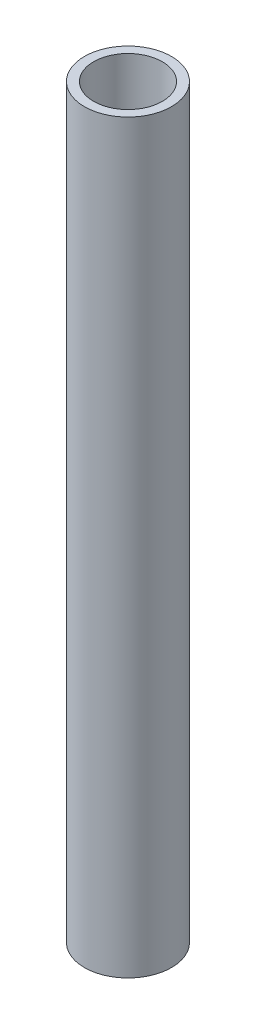
ISO-10303-21;
HEADER;
FILE_DESCRIPTION(('STEP AP214'),'2;1');
FILE_NAME('part.step','',(''),(''),'','','');
FILE_SCHEMA(('AUTOMOTIVE_DESIGN { 1 0 10303 214 1 1 1 1 }'));
ENDSEC;
DATA;
#1=APPLICATION_CONTEXT('core data for automotive mechanical design processes');
#2=APPLICATION_PROTOCOL_DEFINITION('international standard','automotive_design',2000,#1);
#3=PRODUCT_CONTEXT('',#1,'mechanical');
#4=PRODUCT('Part','Part','',(#3));
#5=PRODUCT_RELATED_PRODUCT_CATEGORY('part','',(#4));
#6=PRODUCT_DEFINITION_FORMATION('','',#4);
#7=PRODUCT_DEFINITION_CONTEXT('part definition',#1,'design');
#8=PRODUCT_DEFINITION('design','',#6,#7);
#9=PRODUCT_DEFINITION_SHAPE('','',#8);
#10=(LENGTH_UNIT() NAMED_UNIT(*) SI_UNIT(.MILLI.,.METRE.));
#11=(NAMED_UNIT(*) PLANE_ANGLE_UNIT() SI_UNIT($,.RADIAN.));
#12=(NAMED_UNIT(*) SI_UNIT($,.STERADIAN.) SOLID_ANGLE_UNIT());
#13=UNCERTAINTY_MEASURE_WITH_UNIT(LENGTH_MEASURE(1.E-05),#10,'distance_accuracy_value','');
#14=(GEOMETRIC_REPRESENTATION_CONTEXT(3) GLOBAL_UNCERTAINTY_ASSIGNED_CONTEXT((#13)) GLOBAL_UNIT_ASSIGNED_CONTEXT((#10,
#11,#12)) REPRESENTATION_CONTEXT('',''));
#15=CARTESIAN_POINT('',(0.,0.,0.));
#16=DIRECTION('',(0.,0.,1.));
#17=DIRECTION('',(1.,0.,0.));
#18=AXIS2_PLACEMENT_3D('',#15,#16,#17);
#19=CARTESIAN_POINT('',(0.,206.629,0.));
#20=DIRECTION('',(0.,1.,0.));
#21=DIRECTION('',(0.,0.,1.));
#22=AXIS2_PLACEMENT_3D('',#19,#20,#21);
#23=PLANE('',#22);
#24=CARTESIAN_POINT('',(0.,206.629,0.));
#25=DIRECTION('',(0.,1.,0.));
#26=DIRECTION('',(0.,0.,1.));
#27=AXIS2_PLACEMENT_3D('',#24,#25,#26);
#28=CIRCLE('',#27,24.13);
#29=CARTESIAN_POINT('',(0.,206.629,24.13));
#30=VERTEX_POINT('',#29);
#31=EDGE_CURVE('E10',#30,#30,#28,.T.);
#32=ORIENTED_EDGE('',*,*,#31,.T.);
#33=EDGE_LOOP('',(#32));
#34=FACE_BOUND('',#33,.T.);
#35=CARTESIAN_POINT('',(0.,206.629,0.));
#36=DIRECTION('',(0.,1.,0.));
#37=DIRECTION('',(0.,0.,1.));
#38=AXIS2_PLACEMENT_3D('',#35,#36,#37);
#39=CIRCLE('',#38,19.05);
#40=CARTESIAN_POINT('',(0.,206.629,19.05));
#41=VERTEX_POINT('',#40);
#42=EDGE_CURVE('E45',#41,#41,#39,.T.);
#43=ORIENTED_EDGE('',*,*,#42,.F.);
#44=EDGE_LOOP('',(#43));
#45=FACE_BOUND('',#44,.T.);
#46=ADVANCED_FACE('F34',(#34,#45),#23,.T.);
#47=CARTESIAN_POINT('',(0.,-206.629,0.));
#48=DIRECTION('',(0.,1.,0.));
#49=DIRECTION('',(0.,0.,1.));
#50=AXIS2_PLACEMENT_3D('',#47,#48,#49);
#51=PLANE('',#50);
#52=CARTESIAN_POINT('',(0.,-206.629,0.));
#53=DIRECTION('',(0.,1.,0.));
#54=DIRECTION('',(0.,0.,1.));
#55=AXIS2_PLACEMENT_3D('',#52,#53,#54);
#56=CIRCLE('',#55,24.13);
#57=CARTESIAN_POINT('',(0.,-206.629,24.13));
#58=VERTEX_POINT('',#57);
#59=EDGE_CURVE('E38',#58,#58,#56,.T.);
#60=ORIENTED_EDGE('',*,*,#59,.F.);
#61=EDGE_LOOP('',(#60));
#62=FACE_BOUND('',#61,.T.);
#63=CARTESIAN_POINT('',(0.,-206.629,0.));
#64=DIRECTION('',(0.,1.,0.));
#65=DIRECTION('',(0.,0.,1.));
#66=AXIS2_PLACEMENT_3D('',#63,#64,#65);
#67=CIRCLE('',#66,19.05);
#68=CARTESIAN_POINT('',(0.,-206.629,19.05));
#69=VERTEX_POINT('',#68);
#70=EDGE_CURVE('E47',#69,#69,#67,.T.);
#71=ORIENTED_EDGE('',*,*,#70,.T.);
#72=EDGE_LOOP('',(#71));
#73=FACE_BOUND('',#72,.T.);
#74=ADVANCED_FACE('F57',(#62,#73),#51,.F.);
#75=CARTESIAN_POINT('',(0.,206.629,0.));
#76=DIRECTION('',(0.,-1.,0.));
#77=DIRECTION('',(0.,0.,-1.));
#78=AXIS2_PLACEMENT_3D('',#75,#76,#77);
#79=CYLINDRICAL_SURFACE('',#78,24.13);
#80=ORIENTED_EDGE('',*,*,#31,.F.);
#81=EDGE_LOOP('',(#80));
#82=FACE_BOUND('',#81,.T.);
#83=ORIENTED_EDGE('',*,*,#59,.T.);
#84=EDGE_LOOP('',(#83));
#85=FACE_BOUND('',#84,.T.);
#86=ADVANCED_FACE('F36',(#82,#85),#79,.T.);
#87=CARTESIAN_POINT('',(0.,206.629,0.));
#88=DIRECTION('',(0.,-1.,0.));
#89=DIRECTION('',(0.,0.,-1.));
#90=AXIS2_PLACEMENT_3D('',#87,#88,#89);
#91=CYLINDRICAL_SURFACE('',#90,19.05);
#92=ORIENTED_EDGE('',*,*,#42,.T.);
#93=EDGE_LOOP('',(#92));
#94=FACE_BOUND('',#93,.T.);
#95=ORIENTED_EDGE('',*,*,#70,.F.);
#96=EDGE_LOOP('',(#95));
#97=FACE_BOUND('',#96,.T.);
#98=ADVANCED_FACE('F53',(#94,#97),#91,.F.);
#99=CLOSED_SHELL('',(#46,#74,#86,#98));
#100=MANIFOLD_SOLID_BREP('B2',#99);
#101=ADVANCED_BREP_SHAPE_REPRESENTATION('',(#18,#100),#14);
#102=SHAPE_DEFINITION_REPRESENTATION(#9,#101);
ENDSEC;
END-ISO-10303-21;
